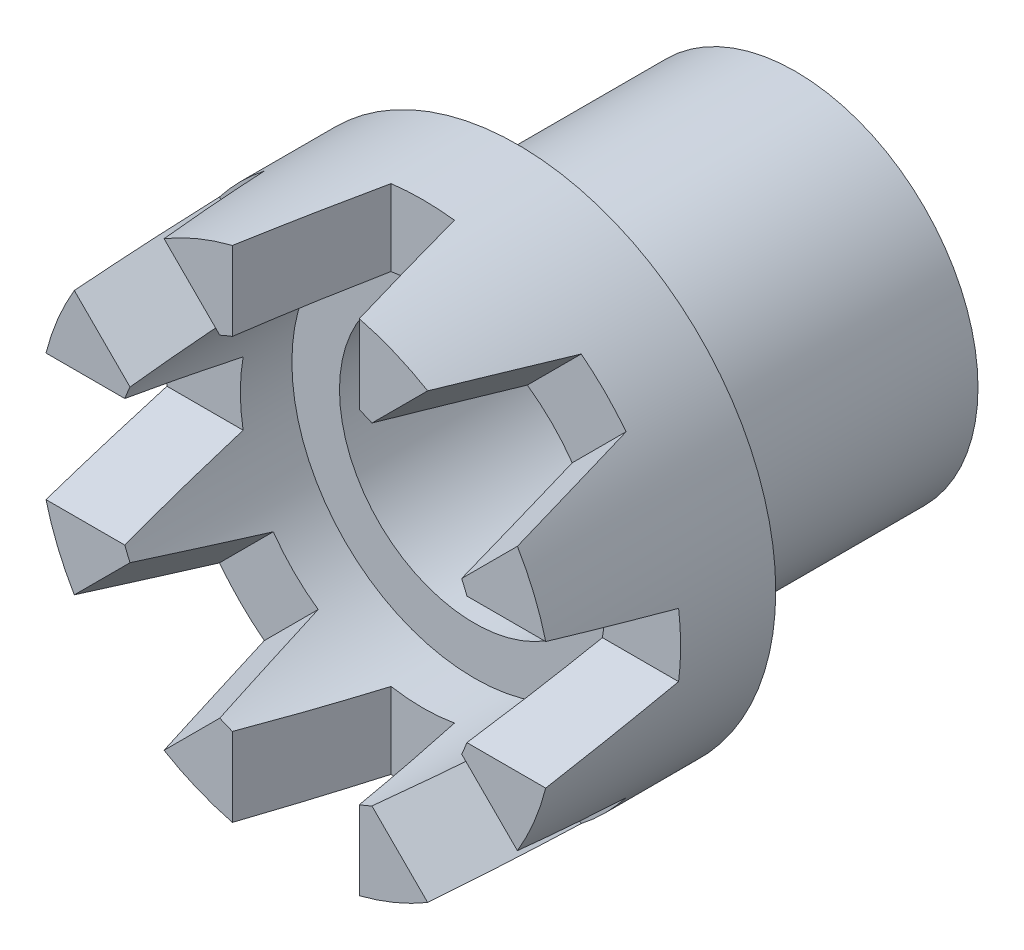
ISO-10303-21;
HEADER;
FILE_DESCRIPTION(('STEP AP214'),'2;1');
FILE_NAME('part.step','',(''),(''),'','','');
FILE_SCHEMA(('AUTOMOTIVE_DESIGN { 1 0 10303 214 1 1 1 1 }'));
ENDSEC;
DATA;
#1=APPLICATION_CONTEXT('core data for automotive mechanical design processes');
#2=APPLICATION_PROTOCOL_DEFINITION('international standard','automotive_design',2000,#1);
#3=PRODUCT_CONTEXT('',#1,'mechanical');
#4=PRODUCT('Part','Part','',(#3));
#5=PRODUCT_RELATED_PRODUCT_CATEGORY('part','',(#4));
#6=PRODUCT_DEFINITION_FORMATION('','',#4);
#7=PRODUCT_DEFINITION_CONTEXT('part definition',#1,'design');
#8=PRODUCT_DEFINITION('design','',#6,#7);
#9=PRODUCT_DEFINITION_SHAPE('','',#8);
#10=(LENGTH_UNIT() NAMED_UNIT(*) SI_UNIT(.MILLI.,.METRE.));
#11=(NAMED_UNIT(*) PLANE_ANGLE_UNIT() SI_UNIT($,.RADIAN.));
#12=(NAMED_UNIT(*) SI_UNIT($,.STERADIAN.) SOLID_ANGLE_UNIT());
#13=UNCERTAINTY_MEASURE_WITH_UNIT(LENGTH_MEASURE(1.E-05),#10,'distance_accuracy_value','');
#14=(GEOMETRIC_REPRESENTATION_CONTEXT(3) GLOBAL_UNCERTAINTY_ASSIGNED_CONTEXT((#13)) GLOBAL_UNIT_ASSIGNED_CONTEXT((#10,
#11,#12)) REPRESENTATION_CONTEXT('',''));
#15=CARTESIAN_POINT('',(0.,0.,0.));
#16=DIRECTION('',(0.,0.,1.));
#17=DIRECTION('',(1.,0.,0.));
#18=AXIS2_PLACEMENT_3D('',#15,#16,#17);
#19=CARTESIAN_POINT('',(0.,0.,0.));
#20=DIRECTION('',(0.,0.,1.));
#21=DIRECTION('',(1.,0.,0.));
#22=AXIS2_PLACEMENT_3D('',#19,#20,#21);
#23=CYLINDRICAL_SURFACE('',#22,46.);
#24=CARTESIAN_POINT('',(0.,0.,-45.));
#25=DIRECTION('',(0.,0.,1.));
#26=DIRECTION('',(1.,0.,0.));
#27=AXIS2_PLACEMENT_3D('',#24,#25,#26);
#28=CIRCLE('',#27,46.);
#29=CARTESIAN_POINT('',(46.,0.,-45.));
#30=VERTEX_POINT('',#29);
#31=EDGE_CURVE('E351',#30,#30,#28,.T.);
#32=ORIENTED_EDGE('',*,*,#31,.F.);
#33=EDGE_LOOP('',(#32));
#34=FACE_BOUND('',#33,.T.);
#35=CARTESIAN_POINT('',(0.,0.,-64.));
#36=DIRECTION('',(-0.685994340570035,0.685994340570035,0.242535625036333));
#37=DIRECTION('',(0.171498585142509,-0.171498585142509,0.970142500145332));
#38=AXIS2_PLACEMENT_3D('',#35,#36,#37);
#39=ELLIPSE('',#38,189.662858778412,46.);
#40=CARTESIAN_POINT('',(37.6880890055863,26.3743805066015,-32.));
#41=VERTEX_POINT('',#40);
#42=CARTESIAN_POINT('',(41.8096098629386,19.182192864969,0.));
#43=VERTEX_POINT('',#42);
#44=EDGE_CURVE('E267',#41,#43,#39,.F.);
#45=ORIENTED_EDGE('',*,*,#44,.F.);
#46=CARTESIAN_POINT('',(0.,0.,-32.));
#47=DIRECTION('',(0.,0.,1.));
#48=DIRECTION('',(1.,0.,0.));
#49=AXIS2_PLACEMENT_3D('',#46,#47,#48);
#50=CIRCLE('',#49,46.);
#51=CARTESIAN_POINT('',(26.3743805066015,37.6880890055863,-32.));
#52=VERTEX_POINT('',#51);
#53=EDGE_CURVE('E270',#52,#41,#50,.F.);
#54=ORIENTED_EDGE('',*,*,#53,.F.);
#55=CARTESIAN_POINT('',(0.,0.,-64.));
#56=DIRECTION('',(0.685994340570035,-0.685994340570035,0.242535625036333));
#57=DIRECTION('',(-0.171498585142509,0.171498585142509,0.970142500145332));
#58=AXIS2_PLACEMENT_3D('',#55,#56,#57);
#59=ELLIPSE('',#58,189.662858778412,46.);
#60=CARTESIAN_POINT('',(19.1821928649691,41.8096098629386,0.));
#61=VERTEX_POINT('',#60);
#62=EDGE_CURVE('E250',#61,#52,#59,.F.);
#63=ORIENTED_EDGE('',*,*,#62,.F.);
#64=CARTESIAN_POINT('',(0.,0.,0.));
#65=DIRECTION('',(0.,0.,1.));
#66=DIRECTION('',(1.,0.,0.));
#67=AXIS2_PLACEMENT_3D('',#64,#65,#66);
#68=CIRCLE('',#67,46.);
#69=CARTESIAN_POINT('',(16.,43.1277173056956,0.));
#70=VERTEX_POINT('',#69);
#71=EDGE_CURVE('E386',#61,#70,#68,.T.);
#72=ORIENTED_EDGE('',*,*,#71,.T.);
#73=CARTESIAN_POINT('',(0.,0.,-64.));
#74=DIRECTION('',(-0.970142500145332,0.,0.242535625036333));
#75=DIRECTION('',(0.242535625036333,0.,0.970142500145332));
#76=AXIS2_PLACEMENT_3D('',#73,#74,#75);
#77=ELLIPSE('',#76,189.662858778412,46.);
#78=CARTESIAN_POINT('',(8.,45.2990066116245,-32.));
#79=VERTEX_POINT('',#78);
#80=EDGE_CURVE('E320',#79,#70,#77,.F.);
#81=ORIENTED_EDGE('',*,*,#80,.F.);
#82=CARTESIAN_POINT('',(0.,0.,-32.));
#83=DIRECTION('',(0.,0.,1.));
#84=DIRECTION('',(1.,0.,0.));
#85=AXIS2_PLACEMENT_3D('',#82,#83,#84);
#86=CIRCLE('',#85,46.);
#87=CARTESIAN_POINT('',(-8.,45.2990066116245,-32.));
#88=VERTEX_POINT('',#87);
#89=EDGE_CURVE('E317',#88,#79,#86,.F.);
#90=ORIENTED_EDGE('',*,*,#89,.F.);
#91=CARTESIAN_POINT('',(0.,0.,-64.));
#92=DIRECTION('',(0.970142500145332,0.,0.242535625036333));
#93=DIRECTION('',(-0.242535625036333,0.,0.970142500145332));
#94=AXIS2_PLACEMENT_3D('',#91,#92,#93);
#95=ELLIPSE('',#94,189.662858778412,46.);
#96=CARTESIAN_POINT('',(-16.,43.1277173056956,0.));
#97=VERTEX_POINT('',#96);
#98=EDGE_CURVE('E316',#97,#88,#95,.F.);
#99=ORIENTED_EDGE('',*,*,#98,.F.);
#100=CARTESIAN_POINT('',(-19.182192864969,41.8096098629386,0.));
#101=VERTEX_POINT('',#100);
#102=EDGE_CURVE('E484',#97,#101,#68,.T.);
#103=ORIENTED_EDGE('',*,*,#102,.T.);
#104=CARTESIAN_POINT('',(0.,0.,-64.));
#105=DIRECTION('',(-0.685994340570035,-0.685994340570035,0.242535625036333));
#106=DIRECTION('',(0.171498585142509,0.171498585142509,0.970142500145332));
#107=AXIS2_PLACEMENT_3D('',#104,#105,#106);
#108=ELLIPSE('',#107,189.662858778412,46.);
#109=CARTESIAN_POINT('',(-26.3743805066015,37.6880890055863,-32.));
#110=VERTEX_POINT('',#109);
#111=EDGE_CURVE('E294',#110,#101,#108,.F.);
#112=ORIENTED_EDGE('',*,*,#111,.F.);
#113=CARTESIAN_POINT('',(0.,0.,-32.));
#114=DIRECTION('',(0.,0.,1.));
#115=DIRECTION('',(1.,0.,0.));
#116=AXIS2_PLACEMENT_3D('',#113,#114,#115);
#117=CIRCLE('',#116,46.);
#118=CARTESIAN_POINT('',(-37.6880890055863,26.3743805066016,-32.));
#119=VERTEX_POINT('',#118);
#120=EDGE_CURVE('E291',#119,#110,#117,.F.);
#121=ORIENTED_EDGE('',*,*,#120,.F.);
#122=CARTESIAN_POINT('',(0.,0.,-64.));
#123=DIRECTION('',(0.685994340570035,0.685994340570035,0.242535625036333));
#124=DIRECTION('',(-0.171498585142509,-0.171498585142509,0.970142500145332));
#125=AXIS2_PLACEMENT_3D('',#122,#123,#124);
#126=ELLIPSE('',#125,189.662858778412,46.);
#127=CARTESIAN_POINT('',(-41.8096098629386,19.182192864969,0.));
#128=VERTEX_POINT('',#127);
#129=EDGE_CURVE('E290',#128,#119,#126,.F.);
#130=ORIENTED_EDGE('',*,*,#129,.F.);
#131=CARTESIAN_POINT('',(-43.1277173056956,16.,0.));
#132=VERTEX_POINT('',#131);
#133=EDGE_CURVE('E482',#128,#132,#68,.T.);
#134=ORIENTED_EDGE('',*,*,#133,.T.);
#135=CARTESIAN_POINT('',(0.,0.,-64.));
#136=DIRECTION('',(0.,-0.970142500145332,0.242535625036333));
#137=DIRECTION('',(0.,0.242535625036333,0.970142500145332));
#138=AXIS2_PLACEMENT_3D('',#135,#136,#137);
#139=ELLIPSE('',#138,189.662858778412,46.);
#140=CARTESIAN_POINT('',(-45.2990066116245,8.,-32.));
#141=VERTEX_POINT('',#140);
#142=EDGE_CURVE('E340',#141,#132,#139,.F.);
#143=ORIENTED_EDGE('',*,*,#142,.F.);
#144=CARTESIAN_POINT('',(0.,0.,-32.));
#145=DIRECTION('',(0.,0.,1.));
#146=DIRECTION('',(1.,0.,0.));
#147=AXIS2_PLACEMENT_3D('',#144,#145,#146);
#148=CIRCLE('',#147,46.);
#149=CARTESIAN_POINT('',(-45.2990066116245,-8.,-32.));
#150=VERTEX_POINT('',#149);
#151=EDGE_CURVE('E346',#150,#141,#148,.F.);
#152=ORIENTED_EDGE('',*,*,#151,.F.);
#153=CARTESIAN_POINT('',(0.,0.,-64.));
#154=DIRECTION('',(0.,0.970142500145332,0.242535625036333));
#155=DIRECTION('',(0.,-0.242535625036333,0.970142500145332));
#156=AXIS2_PLACEMENT_3D('',#153,#154,#155);
#157=ELLIPSE('',#156,189.662858778412,46.);
#158=CARTESIAN_POINT('',(-43.1277173056956,-16.,0.));
#159=VERTEX_POINT('',#158);
#160=EDGE_CURVE('E350',#159,#150,#157,.F.);
#161=ORIENTED_EDGE('',*,*,#160,.F.);
#162=CARTESIAN_POINT('',(-41.8096098629386,-19.182192864969,0.));
#163=VERTEX_POINT('',#162);
#164=EDGE_CURVE('E388',#159,#163,#68,.T.);
#165=ORIENTED_EDGE('',*,*,#164,.T.);
#166=CARTESIAN_POINT('',(-37.6880890055863,-26.3743805066016,-32.));
#167=VERTEX_POINT('',#166);
#168=EDGE_CURVE('E45',#167,#163,#59,.F.);
#169=ORIENTED_EDGE('',*,*,#168,.F.);
#170=CARTESIAN_POINT('',(-26.3743805066016,-37.6880890055863,-32.));
#171=VERTEX_POINT('',#170);
#172=EDGE_CURVE('E272',#171,#167,#50,.F.);
#173=ORIENTED_EDGE('',*,*,#172,.F.);
#174=CARTESIAN_POINT('',(-19.1821928649691,-41.8096098629386,0.));
#175=VERTEX_POINT('',#174);
#176=EDGE_CURVE('E269',#175,#171,#39,.F.);
#177=ORIENTED_EDGE('',*,*,#176,.F.);
#178=CARTESIAN_POINT('',(-16.,-43.1277173056956,0.));
#179=VERTEX_POINT('',#178);
#180=EDGE_CURVE('E387',#175,#179,#68,.T.);
#181=ORIENTED_EDGE('',*,*,#180,.T.);
#182=CARTESIAN_POINT('',(-8.,-45.2990066116245,-32.));
#183=VERTEX_POINT('',#182);
#184=EDGE_CURVE('E313',#183,#179,#95,.F.);
#185=ORIENTED_EDGE('',*,*,#184,.F.);
#186=CARTESIAN_POINT('',(8.,-45.2990066116245,-32.));
#187=VERTEX_POINT('',#186);
#188=EDGE_CURVE('E319',#187,#183,#86,.F.);
#189=ORIENTED_EDGE('',*,*,#188,.F.);
#190=CARTESIAN_POINT('',(16.,-43.1277173056956,0.));
#191=VERTEX_POINT('',#190);
#192=EDGE_CURVE('E323',#191,#187,#77,.F.);
#193=ORIENTED_EDGE('',*,*,#192,.F.);
#194=CARTESIAN_POINT('',(19.182192864969,-41.8096098629386,0.));
#195=VERTEX_POINT('',#194);
#196=EDGE_CURVE('E481',#191,#195,#68,.T.);
#197=ORIENTED_EDGE('',*,*,#196,.T.);
#198=CARTESIAN_POINT('',(26.3743805066015,-37.6880890055863,-32.));
#199=VERTEX_POINT('',#198);
#200=EDGE_CURVE('E288',#199,#195,#126,.F.);
#201=ORIENTED_EDGE('',*,*,#200,.F.);
#202=CARTESIAN_POINT('',(37.6880890055863,-26.3743805066016,-32.));
#203=VERTEX_POINT('',#202);
#204=EDGE_CURVE('E293',#203,#199,#117,.F.);
#205=ORIENTED_EDGE('',*,*,#204,.F.);
#206=CARTESIAN_POINT('',(41.8096098629386,-19.1821928649691,0.));
#207=VERTEX_POINT('',#206);
#208=EDGE_CURVE('E296',#207,#203,#108,.F.);
#209=ORIENTED_EDGE('',*,*,#208,.F.);
#210=CARTESIAN_POINT('',(43.1277173056956,-16.,0.));
#211=VERTEX_POINT('',#210);
#212=EDGE_CURVE('E443',#207,#211,#68,.T.);
#213=ORIENTED_EDGE('',*,*,#212,.T.);
#214=CARTESIAN_POINT('',(45.2990066116245,-8.,-32.));
#215=VERTEX_POINT('',#214);
#216=EDGE_CURVE('E347',#215,#211,#157,.F.);
#217=ORIENTED_EDGE('',*,*,#216,.F.);
#218=CARTESIAN_POINT('',(45.2990066116245,8.,-32.));
#219=VERTEX_POINT('',#218);
#220=EDGE_CURVE('E344',#219,#215,#148,.F.);
#221=ORIENTED_EDGE('',*,*,#220,.F.);
#222=CARTESIAN_POINT('',(43.1277173056956,16.,0.));
#223=VERTEX_POINT('',#222);
#224=EDGE_CURVE('E343',#223,#219,#139,.F.);
#225=ORIENTED_EDGE('',*,*,#224,.F.);
#226=EDGE_CURVE('E382',#223,#43,#68,.T.);
#227=ORIENTED_EDGE('',*,*,#226,.T.);
#228=EDGE_LOOP('',(#45,#54,#63,#72,#81,#90,#99,#103,#112,#121,#130,#134,#143,#152,#161,#165,
#169,#173,#177,#181,#185,#189,#193,#197,#201,#205,#209,#213,#217,#221,#225,#227));
#229=FACE_BOUND('',#228,.T.);
#230=ADVANCED_FACE('F31',(#34,#229),#23,.F.);
#231=CARTESIAN_POINT('',(0.,0.,0.));
#232=DIRECTION('',(0.,0.,1.));
#233=DIRECTION('',(1.,0.,0.));
#234=AXIS2_PLACEMENT_3D('',#231,#232,#233);
#235=CYLINDRICAL_SURFACE('',#234,65.);
#236=CARTESIAN_POINT('',(0.,0.,-56.));
#237=DIRECTION('',(0.,0.,1.));
#238=DIRECTION('',(1.,0.,0.));
#239=AXIS2_PLACEMENT_3D('',#236,#237,#238);
#240=CIRCLE('',#239,65.);
#241=CARTESIAN_POINT('',(65.,0.,-56.));
#242=VERTEX_POINT('',#241);
#243=EDGE_CURVE('E372',#242,#242,#240,.T.);
#244=ORIENTED_EDGE('',*,*,#243,.T.);
#245=EDGE_LOOP('',(#244));
#246=FACE_BOUND('',#245,.T.);
#247=CARTESIAN_POINT('',(0.,0.,-64.));
#248=DIRECTION('',(-0.685994340570035,0.685994340570035,0.242535625036333));
#249=DIRECTION('',(0.171498585142509,-0.171498585142509,0.970142500145332));
#250=AXIS2_PLACEMENT_3D('',#247,#248,#249);
#251=ELLIPSE('',#250,268.001865665148,65.);
#252=CARTESIAN_POINT('',(55.8614357137373,33.2340187157677,0.));
#253=VERTEX_POINT('',#252);
#254=CARTESIAN_POINT('',(51.2693525366943,39.9556440377096,-32.));
#255=VERTEX_POINT('',#254);
#256=EDGE_CURVE('E266',#253,#255,#251,.T.);
#257=ORIENTED_EDGE('',*,*,#256,.F.);
#258=CARTESIAN_POINT('',(0.,0.,0.));
#259=DIRECTION('',(0.,0.,1.));
#260=DIRECTION('',(1.,0.,0.));
#261=AXIS2_PLACEMENT_3D('',#258,#259,#260);
#262=CIRCLE('',#261,65.);
#263=CARTESIAN_POINT('',(63.,16.,0.));
#264=VERTEX_POINT('',#263);
#265=EDGE_CURVE('E381',#264,#253,#262,.T.);
#266=ORIENTED_EDGE('',*,*,#265,.F.);
#267=CARTESIAN_POINT('',(0.,0.,-64.));
#268=DIRECTION('',(0.,-0.970142500145332,0.242535625036333));
#269=DIRECTION('',(0.,0.242535625036333,0.970142500145332));
#270=AXIS2_PLACEMENT_3D('',#267,#268,#269);
#271=ELLIPSE('',#270,268.001865665148,65.);
#272=CARTESIAN_POINT('',(64.5058136914806,8.,-32.));
#273=VERTEX_POINT('',#272);
#274=EDGE_CURVE('E394',#273,#264,#271,.T.);
#275=ORIENTED_EDGE('',*,*,#274,.F.);
#276=CARTESIAN_POINT('',(0.,0.,-32.));
#277=DIRECTION('',(0.,0.,1.));
#278=DIRECTION('',(1.,0.,0.));
#279=AXIS2_PLACEMENT_3D('',#276,#277,#278);
#280=CIRCLE('',#279,65.);
#281=CARTESIAN_POINT('',(64.5058136914806,-8.,-32.));
#282=VERTEX_POINT('',#281);
#283=EDGE_CURVE('E391',#282,#273,#280,.T.);
#284=ORIENTED_EDGE('',*,*,#283,.F.);
#285=CARTESIAN_POINT('',(0.,0.,-64.));
#286=DIRECTION('',(0.,0.970142500145332,0.242535625036333));
#287=DIRECTION('',(0.,-0.242535625036333,0.970142500145332));
#288=AXIS2_PLACEMENT_3D('',#285,#286,#287);
#289=ELLIPSE('',#288,268.001865665148,65.);
#290=CARTESIAN_POINT('',(63.,-16.,0.));
#291=VERTEX_POINT('',#290);
#292=EDGE_CURVE('E393',#291,#282,#289,.T.);
#293=ORIENTED_EDGE('',*,*,#292,.F.);
#294=CARTESIAN_POINT('',(55.8614357137373,-33.2340187157677,0.));
#295=VERTEX_POINT('',#294);
#296=EDGE_CURVE('E375',#295,#291,#262,.T.);
#297=ORIENTED_EDGE('',*,*,#296,.F.);
#298=CARTESIAN_POINT('',(0.,0.,-64.));
#299=DIRECTION('',(-0.685994340570035,-0.685994340570035,0.242535625036333));
#300=DIRECTION('',(0.171498585142509,0.171498585142509,0.970142500145332));
#301=AXIS2_PLACEMENT_3D('',#298,#299,#300);
#302=ELLIPSE('',#301,268.001865665148,65.);
#303=CARTESIAN_POINT('',(51.2693525366943,-39.9556440377096,-32.));
#304=VERTEX_POINT('',#303);
#305=EDGE_CURVE('E408',#304,#295,#302,.T.);
#306=ORIENTED_EDGE('',*,*,#305,.F.);
#307=CARTESIAN_POINT('',(0.,0.,-32.));
#308=DIRECTION('',(0.,0.,1.));
#309=DIRECTION('',(1.,0.,0.));
#310=AXIS2_PLACEMENT_3D('',#307,#308,#309);
#311=CIRCLE('',#310,65.);
#312=CARTESIAN_POINT('',(39.9556440377096,-51.2693525366943,-32.));
#313=VERTEX_POINT('',#312);
#314=EDGE_CURVE('E406',#313,#304,#311,.T.);
#315=ORIENTED_EDGE('',*,*,#314,.F.);
#316=CARTESIAN_POINT('',(0.,0.,-64.));
#317=DIRECTION('',(0.685994340570035,0.685994340570035,0.242535625036333));
#318=DIRECTION('',(-0.171498585142509,-0.171498585142509,0.970142500145332));
#319=AXIS2_PLACEMENT_3D('',#316,#317,#318);
#320=ELLIPSE('',#319,268.001865665148,65.);
#321=CARTESIAN_POINT('',(33.2340187157677,-55.8614357137373,0.));
#322=VERTEX_POINT('',#321);
#323=EDGE_CURVE('E414',#322,#313,#320,.T.);
#324=ORIENTED_EDGE('',*,*,#323,.F.);
#325=CARTESIAN_POINT('',(16.,-63.,0.));
#326=VERTEX_POINT('',#325);
#327=EDGE_CURVE('E436',#326,#322,#262,.T.);
#328=ORIENTED_EDGE('',*,*,#327,.F.);
#329=CARTESIAN_POINT('',(0.,0.,-64.));
#330=DIRECTION('',(-0.970142500145332,0.,0.242535625036333));
#331=DIRECTION('',(0.242535625036333,0.,0.970142500145332));
#332=AXIS2_PLACEMENT_3D('',#329,#330,#331);
#333=ELLIPSE('',#332,268.001865665148,65.);
#334=CARTESIAN_POINT('',(8.,-64.5058136914806,-32.));
#335=VERTEX_POINT('',#334);
#336=EDGE_CURVE('E399',#335,#326,#333,.T.);
#337=ORIENTED_EDGE('',*,*,#336,.F.);
#338=CARTESIAN_POINT('',(0.,0.,-32.));
#339=DIRECTION('',(0.,0.,1.));
#340=DIRECTION('',(1.,0.,0.));
#341=AXIS2_PLACEMENT_3D('',#338,#339,#340);
#342=CIRCLE('',#341,65.);
#343=CARTESIAN_POINT('',(-8.,-64.5058136914806,-32.));
#344=VERTEX_POINT('',#343);
#345=EDGE_CURVE('E397',#344,#335,#342,.T.);
#346=ORIENTED_EDGE('',*,*,#345,.F.);
#347=CARTESIAN_POINT('',(0.,0.,-64.));
#348=DIRECTION('',(0.970142500145332,0.,0.242535625036333));
#349=DIRECTION('',(-0.242535625036333,0.,0.970142500145332));
#350=AXIS2_PLACEMENT_3D('',#347,#348,#349);
#351=ELLIPSE('',#350,268.001865665148,65.);
#352=CARTESIAN_POINT('',(-16.,-63.,0.));
#353=VERTEX_POINT('',#352);
#354=EDGE_CURVE('E405',#353,#344,#351,.T.);
#355=ORIENTED_EDGE('',*,*,#354,.F.);
#356=CARTESIAN_POINT('',(-33.2340187157677,-55.8614357137373,0.));
#357=VERTEX_POINT('',#356);
#358=EDGE_CURVE('E380',#357,#353,#262,.T.);
#359=ORIENTED_EDGE('',*,*,#358,.F.);
#360=CARTESIAN_POINT('',(-39.9556440377096,-51.2693525366943,-32.));
#361=VERTEX_POINT('',#360);
#362=EDGE_CURVE('E264',#361,#357,#251,.T.);
#363=ORIENTED_EDGE('',*,*,#362,.F.);
#364=CARTESIAN_POINT('',(0.,0.,-32.));
#365=DIRECTION('',(0.,0.,1.));
#366=DIRECTION('',(1.,0.,0.));
#367=AXIS2_PLACEMENT_3D('',#364,#365,#366);
#368=CIRCLE('',#367,65.);
#369=CARTESIAN_POINT('',(-51.2693525366943,-39.9556440377096,-32.));
#370=VERTEX_POINT('',#369);
#371=EDGE_CURVE('E34',#370,#361,#368,.T.);
#372=ORIENTED_EDGE('',*,*,#371,.F.);
#373=CARTESIAN_POINT('',(0.,0.,-64.));
#374=DIRECTION('',(0.685994340570035,-0.685994340570035,0.242535625036333));
#375=DIRECTION('',(-0.171498585142509,0.171498585142509,0.970142500145332));
#376=AXIS2_PLACEMENT_3D('',#373,#374,#375);
#377=ELLIPSE('',#376,268.001865665148,65.);
#378=CARTESIAN_POINT('',(-55.8614357137373,-33.2340187157677,0.));
#379=VERTEX_POINT('',#378);
#380=EDGE_CURVE('E258',#379,#370,#377,.T.);
#381=ORIENTED_EDGE('',*,*,#380,.F.);
#382=CARTESIAN_POINT('',(-63.,-16.,0.));
#383=VERTEX_POINT('',#382);
#384=EDGE_CURVE('E376',#383,#379,#262,.T.);
#385=ORIENTED_EDGE('',*,*,#384,.F.);
#386=CARTESIAN_POINT('',(-64.5058136914806,-8.,-32.));
#387=VERTEX_POINT('',#386);
#388=EDGE_CURVE('E390',#387,#383,#289,.T.);
#389=ORIENTED_EDGE('',*,*,#388,.F.);
#390=CARTESIAN_POINT('',(-64.5058136914806,8.,-32.));
#391=VERTEX_POINT('',#390);
#392=EDGE_CURVE('E385',#391,#387,#280,.T.);
#393=ORIENTED_EDGE('',*,*,#392,.F.);
#394=CARTESIAN_POINT('',(-63.,16.,0.));
#395=VERTEX_POINT('',#394);
#396=EDGE_CURVE('E396',#395,#391,#271,.T.);
#397=ORIENTED_EDGE('',*,*,#396,.F.);
#398=CARTESIAN_POINT('',(-55.8614357137373,33.2340187157677,0.));
#399=VERTEX_POINT('',#398);
#400=EDGE_CURVE('E379',#399,#395,#262,.T.);
#401=ORIENTED_EDGE('',*,*,#400,.F.);
#402=CARTESIAN_POINT('',(-51.2693525366943,39.9556440377096,-32.));
#403=VERTEX_POINT('',#402);
#404=EDGE_CURVE('E412',#403,#399,#320,.T.);
#405=ORIENTED_EDGE('',*,*,#404,.F.);
#406=CARTESIAN_POINT('',(-39.9556440377096,51.2693525366943,-32.));
#407=VERTEX_POINT('',#406);
#408=EDGE_CURVE('E409',#407,#403,#311,.T.);
#409=ORIENTED_EDGE('',*,*,#408,.F.);
#410=CARTESIAN_POINT('',(-33.2340187157677,55.8614357137373,0.));
#411=VERTEX_POINT('',#410);
#412=EDGE_CURVE('E411',#411,#407,#302,.T.);
#413=ORIENTED_EDGE('',*,*,#412,.F.);
#414=CARTESIAN_POINT('',(-16.,63.,0.));
#415=VERTEX_POINT('',#414);
#416=EDGE_CURVE('E438',#415,#411,#262,.T.);
#417=ORIENTED_EDGE('',*,*,#416,.F.);
#418=CARTESIAN_POINT('',(-8.,64.5058136914806,-32.));
#419=VERTEX_POINT('',#418);
#420=EDGE_CURVE('E403',#419,#415,#351,.T.);
#421=ORIENTED_EDGE('',*,*,#420,.F.);
#422=CARTESIAN_POINT('',(8.,64.5058136914806,-32.));
#423=VERTEX_POINT('',#422);
#424=EDGE_CURVE('E400',#423,#419,#342,.T.);
#425=ORIENTED_EDGE('',*,*,#424,.F.);
#426=CARTESIAN_POINT('',(16.,63.,0.));
#427=VERTEX_POINT('',#426);
#428=EDGE_CURVE('E402',#427,#423,#333,.T.);
#429=ORIENTED_EDGE('',*,*,#428,.F.);
#430=CARTESIAN_POINT('',(33.2340187157677,55.8614357137373,0.));
#431=VERTEX_POINT('',#430);
#432=EDGE_CURVE('E257',#431,#427,#262,.T.);
#433=ORIENTED_EDGE('',*,*,#432,.F.);
#434=CARTESIAN_POINT('',(39.9556440377095,51.2693525366943,-32.));
#435=VERTEX_POINT('',#434);
#436=EDGE_CURVE('E53',#435,#431,#377,.T.);
#437=ORIENTED_EDGE('',*,*,#436,.F.);
#438=EDGE_CURVE('E11',#255,#435,#368,.T.);
#439=ORIENTED_EDGE('',*,*,#438,.F.);
#440=EDGE_LOOP('',(#257,#266,#275,#284,#293,#297,#306,#315,#324,#328,#337,#346,#355,#359,#363,
#372,#381,#385,#389,#393,#397,#401,#405,#409,#413,#417,#421,#425,#429,#433,#437,#439));
#441=FACE_BOUND('',#440,.T.);
#442=ADVANCED_FACE('F255',(#246,#441),#235,.T.);
#443=CARTESIAN_POINT('',(0.,46.,0.));
#444=DIRECTION('',(0.,0.,-1.));
#445=DIRECTION('',(-1.,0.,0.));
#446=AXIS2_PLACEMENT_3D('',#443,#444,#445);
#447=PLANE('',#446);
#448=DIRECTION('',(-0.707106781186548,-0.707106781186547,0.));
#449=VECTOR('',#448,1.);
#450=CARTESIAN_POINT('',(57.2756492761104,34.6482322781408,0.));
#451=LINE('',#450,#449);
#452=EDGE_CURVE('E498',#175,#357,#451,.T.);
#453=ORIENTED_EDGE('',*,*,#452,.T.);
#454=ORIENTED_EDGE('',*,*,#358,.T.);
#455=DIRECTION('',(0.,-1.,0.));
#456=VECTOR('',#455,1.);
#457=CARTESIAN_POINT('',(-16.,65.,0.));
#458=LINE('',#457,#456);
#459=EDGE_CURVE('E301',#179,#353,#458,.T.);
#460=ORIENTED_EDGE('',*,*,#459,.F.);
#461=ORIENTED_EDGE('',*,*,#180,.F.);
#462=EDGE_LOOP('',(#453,#454,#460,#461));
#463=FACE_BOUND('',#462,.T.);
#464=ADVANCED_FACE('F501',(#463),#447,.F.);
#465=DIRECTION('',(-0.707106781186548,-0.707106781186547,0.));
#466=VECTOR('',#465,1.);
#467=CARTESIAN_POINT('',(34.6482322781408,57.2756492761104,0.));
#468=LINE('',#467,#466);
#469=EDGE_CURVE('E497',#163,#379,#468,.T.);
#470=ORIENTED_EDGE('',*,*,#469,.F.);
#471=ORIENTED_EDGE('',*,*,#164,.F.);
#472=DIRECTION('',(-1.,0.,0.));
#473=VECTOR('',#472,1.);
#474=CARTESIAN_POINT('',(65.,-16.,0.));
#475=LINE('',#474,#473);
#476=EDGE_CURVE('E324',#159,#383,#475,.T.);
#477=ORIENTED_EDGE('',*,*,#476,.T.);
#478=ORIENTED_EDGE('',*,*,#384,.T.);
#479=EDGE_LOOP('',(#470,#471,#477,#478));
#480=FACE_BOUND('',#479,.T.);
#481=ADVANCED_FACE('F495',(#480),#447,.F.);
#482=DIRECTION('',(0.707106781186548,0.707106781186547,0.));
#483=VECTOR('',#482,1.);
#484=CARTESIAN_POINT('',(34.3137084989848,11.6862915010152,0.));
#485=LINE('',#484,#483);
#486=EDGE_CURVE('E416',#43,#253,#485,.T.);
#487=ORIENTED_EDGE('',*,*,#486,.F.);
#488=ORIENTED_EDGE('',*,*,#226,.F.);
#489=DIRECTION('',(-1.,0.,0.));
#490=VECTOR('',#489,1.);
#491=CARTESIAN_POINT('',(65.,16.,0.));
#492=LINE('',#491,#490);
#493=EDGE_CURVE('E331',#264,#223,#492,.T.);
#494=ORIENTED_EDGE('',*,*,#493,.F.);
#495=ORIENTED_EDGE('',*,*,#265,.T.);
#496=EDGE_LOOP('',(#487,#488,#494,#495));
#497=FACE_BOUND('',#496,.T.);
#498=ADVANCED_FACE('F475',(#497),#447,.F.);
#499=DIRECTION('',(-0.707106781186548,-0.707106781186547,0.));
#500=VECTOR('',#499,1.);
#501=CARTESIAN_POINT('',(11.6862915010152,34.3137084989848,0.));
#502=LINE('',#501,#500);
#503=EDGE_CURVE('E415',#431,#61,#502,.T.);
#504=ORIENTED_EDGE('',*,*,#503,.F.);
#505=ORIENTED_EDGE('',*,*,#432,.T.);
#506=DIRECTION('',(0.,-1.,0.));
#507=VECTOR('',#506,1.);
#508=CARTESIAN_POINT('',(16.,65.,0.));
#509=LINE('',#508,#507);
#510=EDGE_CURVE('E300',#427,#70,#509,.T.);
#511=ORIENTED_EDGE('',*,*,#510,.T.);
#512=ORIENTED_EDGE('',*,*,#71,.F.);
#513=EDGE_LOOP('',(#504,#505,#511,#512));
#514=FACE_BOUND('',#513,.T.);
#515=ADVANCED_FACE('F576',(#514),#447,.F.);
#516=DIRECTION('',(0.707106781186547,-0.707106781186548,0.));
#517=VECTOR('',#516,1.);
#518=CARTESIAN_POINT('',(-34.6482322781408,57.2756492761104,0.));
#519=LINE('',#518,#517);
#520=EDGE_CURVE('E273',#207,#295,#519,.T.);
#521=ORIENTED_EDGE('',*,*,#520,.T.);
#522=ORIENTED_EDGE('',*,*,#296,.T.);
#523=EDGE_CURVE('E327',#291,#211,#475,.T.);
#524=ORIENTED_EDGE('',*,*,#523,.T.);
#525=ORIENTED_EDGE('',*,*,#212,.F.);
#526=EDGE_LOOP('',(#521,#522,#524,#525));
#527=FACE_BOUND('',#526,.T.);
#528=ADVANCED_FACE('F453',(#527),#447,.F.);
#529=DIRECTION('',(0.707106781186547,-0.707106781186548,0.));
#530=VECTOR('',#529,1.);
#531=CARTESIAN_POINT('',(-57.2756492761104,34.6482322781408,0.));
#532=LINE('',#531,#530);
#533=EDGE_CURVE('E277',#195,#322,#532,.T.);
#534=ORIENTED_EDGE('',*,*,#533,.F.);
#535=ORIENTED_EDGE('',*,*,#196,.F.);
#536=EDGE_CURVE('E297',#191,#326,#509,.T.);
#537=ORIENTED_EDGE('',*,*,#536,.T.);
#538=ORIENTED_EDGE('',*,*,#327,.T.);
#539=EDGE_LOOP('',(#534,#535,#537,#538));
#540=FACE_BOUND('',#539,.T.);
#541=ADVANCED_FACE('F556',(#540),#447,.F.);
#542=EDGE_CURVE('E276',#411,#101,#519,.T.);
#543=ORIENTED_EDGE('',*,*,#542,.T.);
#544=ORIENTED_EDGE('',*,*,#102,.F.);
#545=EDGE_CURVE('E304',#415,#97,#458,.T.);
#546=ORIENTED_EDGE('',*,*,#545,.F.);
#547=ORIENTED_EDGE('',*,*,#416,.T.);
#548=EDGE_LOOP('',(#543,#544,#546,#547));
#549=FACE_BOUND('',#548,.T.);
#550=ADVANCED_FACE('F539',(#549),#447,.F.);
#551=EDGE_CURVE('E279',#399,#128,#532,.T.);
#552=ORIENTED_EDGE('',*,*,#551,.F.);
#553=ORIENTED_EDGE('',*,*,#400,.T.);
#554=EDGE_CURVE('E328',#132,#395,#492,.T.);
#555=ORIENTED_EDGE('',*,*,#554,.F.);
#556=ORIENTED_EDGE('',*,*,#133,.F.);
#557=EDGE_LOOP('',(#552,#553,#555,#556));
#558=FACE_BOUND('',#557,.T.);
#559=ADVANCED_FACE('F517',(#558),#447,.F.);
#560=CARTESIAN_POINT('',(0.,65.,-56.));
#561=DIRECTION('',(0.,0.,1.));
#562=DIRECTION('',(1.,0.,0.));
#563=AXIS2_PLACEMENT_3D('',#560,#561,#562);
#564=PLANE('',#563);
#565=ORIENTED_EDGE('',*,*,#243,.F.);
#566=EDGE_LOOP('',(#565));
#567=FACE_BOUND('',#566,.T.);
#568=CARTESIAN_POINT('',(0.,0.,-56.));
#569=DIRECTION('',(0.,0.,1.));
#570=DIRECTION('',(1.,0.,0.));
#571=AXIS2_PLACEMENT_3D('',#568,#569,#570);
#572=CIRCLE('',#571,46.);
#573=CARTESIAN_POINT('',(46.,0.,-56.));
#574=VERTEX_POINT('',#573);
#575=EDGE_CURVE('E369',#574,#574,#572,.T.);
#576=ORIENTED_EDGE('',*,*,#575,.T.);
#577=EDGE_LOOP('',(#576));
#578=FACE_BOUND('',#577,.T.);
#579=ADVANCED_FACE('F628',(#567,#578),#564,.F.);
#580=CARTESIAN_POINT('',(0.,0.,0.));
#581=DIRECTION('',(0.,0.,1.));
#582=DIRECTION('',(1.,0.,0.));
#583=AXIS2_PLACEMENT_3D('',#580,#581,#582);
#584=CYLINDRICAL_SURFACE('',#583,46.);
#585=ORIENTED_EDGE('',*,*,#575,.F.);
#586=EDGE_LOOP('',(#585));
#587=FACE_BOUND('',#586,.T.);
#588=CARTESIAN_POINT('',(0.,0.,-126.));
#589=DIRECTION('',(0.,0.,1.));
#590=DIRECTION('',(1.,0.,0.));
#591=AXIS2_PLACEMENT_3D('',#588,#589,#590);
#592=CIRCLE('',#591,46.);
#593=CARTESIAN_POINT('',(46.,0.,-126.));
#594=VERTEX_POINT('',#593);
#595=EDGE_CURVE('E366',#594,#594,#592,.T.);
#596=ORIENTED_EDGE('',*,*,#595,.T.);
#597=EDGE_LOOP('',(#596));
#598=FACE_BOUND('',#597,.T.);
#599=ADVANCED_FACE('F624',(#587,#598),#584,.T.);
#600=CARTESIAN_POINT('',(0.,46.,-126.));
#601=DIRECTION('',(0.,0.,1.));
#602=DIRECTION('',(1.,0.,0.));
#603=AXIS2_PLACEMENT_3D('',#600,#601,#602);
#604=PLANE('',#603);
#605=ORIENTED_EDGE('',*,*,#595,.F.);
#606=EDGE_LOOP('',(#605));
#607=FACE_BOUND('',#606,.T.);
#608=CARTESIAN_POINT('',(0.,0.,-126.));
#609=DIRECTION('',(0.,0.,1.));
#610=DIRECTION('',(1.,0.,0.));
#611=AXIS2_PLACEMENT_3D('',#608,#609,#610);
#612=CIRCLE('',#611,32.);
#613=CARTESIAN_POINT('',(32.,0.,-126.));
#614=VERTEX_POINT('',#613);
#615=EDGE_CURVE('E363',#614,#614,#612,.T.);
#616=ORIENTED_EDGE('',*,*,#615,.T.);
#617=EDGE_LOOP('',(#616));
#618=FACE_BOUND('',#617,.T.);
#619=ADVANCED_FACE('F620',(#607,#618),#604,.F.);
#620=CARTESIAN_POINT('',(0.,0.,0.));
#621=DIRECTION('',(0.,0.,1.));
#622=DIRECTION('',(1.,0.,0.));
#623=AXIS2_PLACEMENT_3D('',#620,#621,#622);
#624=CYLINDRICAL_SURFACE('',#623,32.);
#625=ORIENTED_EDGE('',*,*,#615,.F.);
#626=EDGE_LOOP('',(#625));
#627=FACE_BOUND('',#626,.T.);
#628=CARTESIAN_POINT('',(0.,0.,-123.));
#629=DIRECTION('',(0.,0.,1.));
#630=DIRECTION('',(1.,0.,0.));
#631=AXIS2_PLACEMENT_3D('',#628,#629,#630);
#632=CIRCLE('',#631,32.);
#633=CARTESIAN_POINT('',(32.,0.,-123.));
#634=VERTEX_POINT('',#633);
#635=EDGE_CURVE('E360',#634,#634,#632,.T.);
#636=ORIENTED_EDGE('',*,*,#635,.T.);
#637=EDGE_LOOP('',(#636));
#638=FACE_BOUND('',#637,.T.);
#639=ADVANCED_FACE('F616',(#627,#638),#624,.F.);
#640=CARTESIAN_POINT('',(0.,32.,-123.));
#641=DIRECTION('',(0.,0.,-1.));
#642=DIRECTION('',(-1.,0.,0.));
#643=AXIS2_PLACEMENT_3D('',#640,#641,#642);
#644=PLANE('',#643);
#645=ORIENTED_EDGE('',*,*,#635,.F.);
#646=EDGE_LOOP('',(#645));
#647=FACE_BOUND('',#646,.T.);
#648=CARTESIAN_POINT('',(0.,0.,-123.));
#649=DIRECTION('',(0.,0.,1.));
#650=DIRECTION('',(1.,0.,0.));
#651=AXIS2_PLACEMENT_3D('',#648,#649,#650);
#652=CIRCLE('',#651,34.);
#653=CARTESIAN_POINT('',(34.,0.,-123.));
#654=VERTEX_POINT('',#653);
#655=EDGE_CURVE('E357',#654,#654,#652,.T.);
#656=ORIENTED_EDGE('',*,*,#655,.T.);
#657=EDGE_LOOP('',(#656));
#658=FACE_BOUND('',#657,.T.);
#659=ADVANCED_FACE('F607',(#647,#658),#644,.F.);
#660=CARTESIAN_POINT('',(0.,0.,0.));
#661=DIRECTION('',(0.,0.,1.));
#662=DIRECTION('',(1.,0.,0.));
#663=AXIS2_PLACEMENT_3D('',#660,#661,#662);
#664=CYLINDRICAL_SURFACE('',#663,34.);
#665=ORIENTED_EDGE('',*,*,#655,.F.);
#666=EDGE_LOOP('',(#665));
#667=FACE_BOUND('',#666,.T.);
#668=CARTESIAN_POINT('',(0.,0.,-45.));
#669=DIRECTION('',(0.,0.,1.));
#670=DIRECTION('',(1.,0.,0.));
#671=AXIS2_PLACEMENT_3D('',#668,#669,#670);
#672=CIRCLE('',#671,34.);
#673=CARTESIAN_POINT('',(34.,0.,-45.));
#674=VERTEX_POINT('',#673);
#675=EDGE_CURVE('E354',#674,#674,#672,.T.);
#676=ORIENTED_EDGE('',*,*,#675,.T.);
#677=EDGE_LOOP('',(#676));
#678=FACE_BOUND('',#677,.T.);
#679=ADVANCED_FACE('F599',(#667,#678),#664,.F.);
#680=CARTESIAN_POINT('',(0.,34.,-45.));
#681=DIRECTION('',(0.,0.,-1.));
#682=DIRECTION('',(-1.,0.,0.));
#683=AXIS2_PLACEMENT_3D('',#680,#681,#682);
#684=PLANE('',#683);
#685=ORIENTED_EDGE('',*,*,#675,.F.);
#686=EDGE_LOOP('',(#685));
#687=FACE_BOUND('',#686,.T.);
#688=ORIENTED_EDGE('',*,*,#31,.T.);
#689=EDGE_LOOP('',(#688));
#690=FACE_BOUND('',#689,.T.);
#691=ADVANCED_FACE('F597',(#687,#690),#684,.F.);
#692=CARTESIAN_POINT('',(65.,16.,0.));
#693=DIRECTION('',(0.,-0.970142500145332,0.242535625036333));
#694=DIRECTION('',(0.,-0.242535625036333,-0.970142500145332));
#695=AXIS2_PLACEMENT_3D('',#692,#693,#694);
#696=PLANE('',#695);
#697=ORIENTED_EDGE('',*,*,#224,.T.);
#698=DIRECTION('',(-1.,0.,0.));
#699=VECTOR('',#698,1.);
#700=CARTESIAN_POINT('',(65.,8.,-32.));
#701=LINE('',#700,#699);
#702=EDGE_CURVE('E335',#273,#219,#701,.T.);
#703=ORIENTED_EDGE('',*,*,#702,.F.);
#704=ORIENTED_EDGE('',*,*,#274,.T.);
#705=ORIENTED_EDGE('',*,*,#493,.T.);
#706=EDGE_LOOP('',(#697,#703,#704,#705));
#707=FACE_BOUND('',#706,.T.);
#708=ADVANCED_FACE('F470',(#707),#696,.T.);
#709=CARTESIAN_POINT('',(65.,-8.,-32.));
#710=DIRECTION('',(0.,0.,1.));
#711=DIRECTION('',(1.,0.,0.));
#712=AXIS2_PLACEMENT_3D('',#709,#710,#711);
#713=PLANE('',#712);
#714=ORIENTED_EDGE('',*,*,#220,.T.);
#715=DIRECTION('',(-1.,0.,0.));
#716=VECTOR('',#715,1.);
#717=CARTESIAN_POINT('',(65.,-8.,-32.));
#718=LINE('',#717,#716);
#719=EDGE_CURVE('E339',#282,#215,#718,.T.);
#720=ORIENTED_EDGE('',*,*,#719,.F.);
#721=ORIENTED_EDGE('',*,*,#283,.T.);
#722=ORIENTED_EDGE('',*,*,#702,.T.);
#723=EDGE_LOOP('',(#714,#720,#721,#722));
#724=FACE_BOUND('',#723,.T.);
#725=ADVANCED_FACE('F467',(#724),#713,.T.);
#726=CARTESIAN_POINT('',(65.,-16.,0.));
#727=DIRECTION('',(0.,0.970142500145332,0.242535625036333));
#728=DIRECTION('',(0.,-0.242535625036333,0.970142500145332));
#729=AXIS2_PLACEMENT_3D('',#726,#727,#728);
#730=PLANE('',#729);
#731=ORIENTED_EDGE('',*,*,#216,.T.);
#732=ORIENTED_EDGE('',*,*,#523,.F.);
#733=ORIENTED_EDGE('',*,*,#292,.T.);
#734=ORIENTED_EDGE('',*,*,#719,.T.);
#735=EDGE_LOOP('',(#731,#732,#733,#734));
#736=FACE_BOUND('',#735,.T.);
#737=ADVANCED_FACE('F458',(#736),#730,.T.);
#738=ORIENTED_EDGE('',*,*,#160,.T.);
#739=EDGE_CURVE('E336',#150,#387,#718,.T.);
#740=ORIENTED_EDGE('',*,*,#739,.T.);
#741=ORIENTED_EDGE('',*,*,#388,.T.);
#742=ORIENTED_EDGE('',*,*,#476,.F.);
#743=EDGE_LOOP('',(#738,#740,#741,#742));
#744=FACE_BOUND('',#743,.T.);
#745=ADVANCED_FACE('F507',(#744),#730,.T.);
#746=ORIENTED_EDGE('',*,*,#151,.T.);
#747=EDGE_CURVE('E332',#141,#391,#701,.T.);
#748=ORIENTED_EDGE('',*,*,#747,.T.);
#749=ORIENTED_EDGE('',*,*,#392,.T.);
#750=ORIENTED_EDGE('',*,*,#739,.F.);
#751=EDGE_LOOP('',(#746,#748,#749,#750));
#752=FACE_BOUND('',#751,.T.);
#753=ADVANCED_FACE('F510',(#752),#713,.T.);
#754=ORIENTED_EDGE('',*,*,#142,.T.);
#755=ORIENTED_EDGE('',*,*,#554,.T.);
#756=ORIENTED_EDGE('',*,*,#396,.T.);
#757=ORIENTED_EDGE('',*,*,#747,.F.);
#758=EDGE_LOOP('',(#754,#755,#756,#757));
#759=FACE_BOUND('',#758,.T.);
#760=ADVANCED_FACE('F516',(#759),#696,.T.);
#761=CARTESIAN_POINT('',(-16.,65.,0.));
#762=DIRECTION('',(0.970142500145332,0.,0.242535625036333));
#763=DIRECTION('',(0.242535625036333,0.,-0.970142500145332));
#764=AXIS2_PLACEMENT_3D('',#761,#762,#763);
#765=PLANE('',#764);
#766=ORIENTED_EDGE('',*,*,#98,.T.);
#767=DIRECTION('',(0.,-1.,0.));
#768=VECTOR('',#767,1.);
#769=CARTESIAN_POINT('',(-8.,65.,-32.));
#770=LINE('',#769,#768);
#771=EDGE_CURVE('E308',#419,#88,#770,.T.);
#772=ORIENTED_EDGE('',*,*,#771,.F.);
#773=ORIENTED_EDGE('',*,*,#420,.T.);
#774=ORIENTED_EDGE('',*,*,#545,.T.);
#775=EDGE_LOOP('',(#766,#772,#773,#774));
#776=FACE_BOUND('',#775,.T.);
#777=ADVANCED_FACE('F663',(#776),#765,.T.);
#778=CARTESIAN_POINT('',(8.,65.,-32.));
#779=DIRECTION('',(0.,0.,1.));
#780=DIRECTION('',(1.,0.,0.));
#781=AXIS2_PLACEMENT_3D('',#778,#779,#780);
#782=PLANE('',#781);
#783=ORIENTED_EDGE('',*,*,#89,.T.);
#784=DIRECTION('',(0.,-1.,0.));
#785=VECTOR('',#784,1.);
#786=CARTESIAN_POINT('',(8.,65.,-32.));
#787=LINE('',#786,#785);
#788=EDGE_CURVE('E312',#423,#79,#787,.T.);
#789=ORIENTED_EDGE('',*,*,#788,.F.);
#790=ORIENTED_EDGE('',*,*,#424,.T.);
#791=ORIENTED_EDGE('',*,*,#771,.T.);
#792=EDGE_LOOP('',(#783,#789,#790,#791));
#793=FACE_BOUND('',#792,.T.);
#794=ADVANCED_FACE('F574',(#793),#782,.T.);
#795=CARTESIAN_POINT('',(16.,65.,0.));
#796=DIRECTION('',(-0.970142500145332,0.,0.242535625036333));
#797=DIRECTION('',(0.242535625036333,0.,0.970142500145332));
#798=AXIS2_PLACEMENT_3D('',#795,#796,#797);
#799=PLANE('',#798);
#800=ORIENTED_EDGE('',*,*,#80,.T.);
#801=ORIENTED_EDGE('',*,*,#510,.F.);
#802=ORIENTED_EDGE('',*,*,#428,.T.);
#803=ORIENTED_EDGE('',*,*,#788,.T.);
#804=EDGE_LOOP('',(#800,#801,#802,#803));
#805=FACE_BOUND('',#804,.T.);
#806=ADVANCED_FACE('F571',(#805),#799,.T.);
#807=ORIENTED_EDGE('',*,*,#192,.T.);
#808=EDGE_CURVE('E309',#187,#335,#787,.T.);
#809=ORIENTED_EDGE('',*,*,#808,.T.);
#810=ORIENTED_EDGE('',*,*,#336,.T.);
#811=ORIENTED_EDGE('',*,*,#536,.F.);
#812=EDGE_LOOP('',(#807,#809,#810,#811));
#813=FACE_BOUND('',#812,.T.);
#814=ADVANCED_FACE('F559',(#813),#799,.T.);
#815=ORIENTED_EDGE('',*,*,#188,.T.);
#816=EDGE_CURVE('E305',#183,#344,#770,.T.);
#817=ORIENTED_EDGE('',*,*,#816,.T.);
#818=ORIENTED_EDGE('',*,*,#345,.T.);
#819=ORIENTED_EDGE('',*,*,#808,.F.);
#820=EDGE_LOOP('',(#815,#817,#818,#819));
#821=FACE_BOUND('',#820,.T.);
#822=ADVANCED_FACE('F563',(#821),#782,.T.);
#823=ORIENTED_EDGE('',*,*,#184,.T.);
#824=ORIENTED_EDGE('',*,*,#459,.T.);
#825=ORIENTED_EDGE('',*,*,#354,.T.);
#826=ORIENTED_EDGE('',*,*,#816,.F.);
#827=EDGE_LOOP('',(#823,#824,#825,#826));
#828=FACE_BOUND('',#827,.T.);
#829=ADVANCED_FACE('F566',(#828),#765,.T.);
#830=CARTESIAN_POINT('',(-57.2756492761104,34.6482322781408,0.));
#831=DIRECTION('',(0.685994340570035,0.685994340570035,0.242535625036333));
#832=DIRECTION('',(-0.707106781186547,0.707106781186548,0.));
#833=AXIS2_PLACEMENT_3D('',#830,#831,#832);
#834=PLANE('',#833);
#835=ORIENTED_EDGE('',*,*,#129,.T.);
#836=DIRECTION('',(0.707106781186547,-0.707106781186548,0.));
#837=VECTOR('',#836,1.);
#838=CARTESIAN_POINT('',(-51.618795026618,40.3050865276332,-32.));
#839=LINE('',#838,#837);
#840=EDGE_CURVE('E283',#403,#119,#839,.T.);
#841=ORIENTED_EDGE('',*,*,#840,.F.);
#842=ORIENTED_EDGE('',*,*,#404,.T.);
#843=ORIENTED_EDGE('',*,*,#551,.T.);
#844=EDGE_LOOP('',(#835,#841,#842,#843));
#845=FACE_BOUND('',#844,.T.);
#846=ADVANCED_FACE('F523',(#845),#834,.T.);
#847=CARTESIAN_POINT('',(-40.3050865276332,51.618795026618,-32.));
#848=DIRECTION('',(0.,0.,1.));
#849=DIRECTION('',(1.,0.,0.));
#850=AXIS2_PLACEMENT_3D('',#847,#848,#849);
#851=PLANE('',#850);
#852=ORIENTED_EDGE('',*,*,#120,.T.);
#853=DIRECTION('',(0.707106781186547,-0.707106781186548,0.));
#854=VECTOR('',#853,1.);
#855=CARTESIAN_POINT('',(-40.3050865276332,51.618795026618,-32.));
#856=LINE('',#855,#854);
#857=EDGE_CURVE('E287',#407,#110,#856,.T.);
#858=ORIENTED_EDGE('',*,*,#857,.F.);
#859=ORIENTED_EDGE('',*,*,#408,.T.);
#860=ORIENTED_EDGE('',*,*,#840,.T.);
#861=EDGE_LOOP('',(#852,#858,#859,#860));
#862=FACE_BOUND('',#861,.T.);
#863=ADVANCED_FACE('F528',(#862),#851,.T.);
#864=CARTESIAN_POINT('',(-34.6482322781408,57.2756492761104,0.));
#865=DIRECTION('',(-0.685994340570035,-0.685994340570035,0.242535625036333));
#866=DIRECTION('',(0.707106781186547,-0.707106781186548,0.));
#867=AXIS2_PLACEMENT_3D('',#864,#865,#866);
#868=PLANE('',#867);
#869=ORIENTED_EDGE('',*,*,#111,.T.);
#870=ORIENTED_EDGE('',*,*,#542,.F.);
#871=ORIENTED_EDGE('',*,*,#412,.T.);
#872=ORIENTED_EDGE('',*,*,#857,.T.);
#873=EDGE_LOOP('',(#869,#870,#871,#872));
#874=FACE_BOUND('',#873,.T.);
#875=ADVANCED_FACE('F532',(#874),#868,.T.);
#876=ORIENTED_EDGE('',*,*,#208,.T.);
#877=EDGE_CURVE('E284',#203,#304,#856,.T.);
#878=ORIENTED_EDGE('',*,*,#877,.T.);
#879=ORIENTED_EDGE('',*,*,#305,.T.);
#880=ORIENTED_EDGE('',*,*,#520,.F.);
#881=EDGE_LOOP('',(#876,#878,#879,#880));
#882=FACE_BOUND('',#881,.T.);
#883=ADVANCED_FACE('F788',(#882),#868,.T.);
#884=ORIENTED_EDGE('',*,*,#204,.T.);
#885=EDGE_CURVE('E280',#199,#313,#839,.T.);
#886=ORIENTED_EDGE('',*,*,#885,.T.);
#887=ORIENTED_EDGE('',*,*,#314,.T.);
#888=ORIENTED_EDGE('',*,*,#877,.F.);
#889=EDGE_LOOP('',(#884,#886,#887,#888));
#890=FACE_BOUND('',#889,.T.);
#891=ADVANCED_FACE('F551',(#890),#851,.T.);
#892=ORIENTED_EDGE('',*,*,#200,.T.);
#893=ORIENTED_EDGE('',*,*,#533,.T.);
#894=ORIENTED_EDGE('',*,*,#323,.T.);
#895=ORIENTED_EDGE('',*,*,#885,.F.);
#896=EDGE_LOOP('',(#892,#893,#894,#895));
#897=FACE_BOUND('',#896,.T.);
#898=ADVANCED_FACE('F546',(#897),#834,.T.);
#899=CARTESIAN_POINT('',(57.2756492761104,34.6482322781408,0.));
#900=DIRECTION('',(-0.685994340570035,0.685994340570035,0.242535625036333));
#901=DIRECTION('',(-0.707106781186548,-0.707106781186547,0.));
#902=AXIS2_PLACEMENT_3D('',#899,#900,#901);
#903=PLANE('',#902);
#904=ORIENTED_EDGE('',*,*,#44,.T.);
#905=ORIENTED_EDGE('',*,*,#486,.T.);
#906=ORIENTED_EDGE('',*,*,#256,.T.);
#907=DIRECTION('',(-0.707106781186548,-0.707106781186547,0.));
#908=VECTOR('',#907,1.);
#909=CARTESIAN_POINT('',(51.618795026618,40.3050865276332,-32.));
#910=LINE('',#909,#908);
#911=EDGE_CURVE('E244',#255,#41,#910,.T.);
#912=ORIENTED_EDGE('',*,*,#911,.T.);
#913=EDGE_LOOP('',(#904,#905,#906,#912));
#914=FACE_BOUND('',#913,.T.);
#915=ADVANCED_FACE('F577',(#914),#903,.T.);
#916=CARTESIAN_POINT('',(34.6482322781408,57.2756492761104,0.));
#917=DIRECTION('',(0.685994340570035,-0.685994340570035,0.242535625036333));
#918=DIRECTION('',(0.707106781186548,0.707106781186547,0.));
#919=AXIS2_PLACEMENT_3D('',#916,#917,#918);
#920=PLANE('',#919);
#921=ORIENTED_EDGE('',*,*,#62,.T.);
#922=DIRECTION('',(-0.707106781186548,-0.707106781186547,0.));
#923=VECTOR('',#922,1.);
#924=CARTESIAN_POINT('',(40.3050865276332,51.618795026618,-32.));
#925=LINE('',#924,#923);
#926=EDGE_CURVE('E241',#435,#52,#925,.T.);
#927=ORIENTED_EDGE('',*,*,#926,.F.);
#928=ORIENTED_EDGE('',*,*,#436,.T.);
#929=ORIENTED_EDGE('',*,*,#503,.T.);
#930=EDGE_LOOP('',(#921,#927,#928,#929));
#931=FACE_BOUND('',#930,.T.);
#932=ADVANCED_FACE('F248',(#931),#920,.T.);
#933=CARTESIAN_POINT('',(51.618795026618,40.3050865276332,-32.));
#934=DIRECTION('',(0.,0.,1.));
#935=DIRECTION('',(1.,0.,0.));
#936=AXIS2_PLACEMENT_3D('',#933,#934,#935);
#937=PLANE('',#936);
#938=ORIENTED_EDGE('',*,*,#53,.T.);
#939=ORIENTED_EDGE('',*,*,#911,.F.);
#940=ORIENTED_EDGE('',*,*,#438,.T.);
#941=ORIENTED_EDGE('',*,*,#926,.T.);
#942=EDGE_LOOP('',(#938,#939,#940,#941));
#943=FACE_BOUND('',#942,.T.);
#944=ADVANCED_FACE('F240',(#943),#937,.T.);
#945=ORIENTED_EDGE('',*,*,#172,.T.);
#946=EDGE_CURVE('E252',#167,#370,#925,.T.);
#947=ORIENTED_EDGE('',*,*,#946,.T.);
#948=ORIENTED_EDGE('',*,*,#371,.T.);
#949=EDGE_CURVE('E251',#171,#361,#910,.T.);
#950=ORIENTED_EDGE('',*,*,#949,.F.);
#951=EDGE_LOOP('',(#945,#947,#948,#950));
#952=FACE_BOUND('',#951,.T.);
#953=ADVANCED_FACE('F423',(#952),#937,.T.);
#954=ORIENTED_EDGE('',*,*,#176,.T.);
#955=ORIENTED_EDGE('',*,*,#949,.T.);
#956=ORIENTED_EDGE('',*,*,#362,.T.);
#957=ORIENTED_EDGE('',*,*,#452,.F.);
#958=EDGE_LOOP('',(#954,#955,#956,#957));
#959=FACE_BOUND('',#958,.T.);
#960=ADVANCED_FACE('F428',(#959),#903,.T.);
#961=ORIENTED_EDGE('',*,*,#168,.T.);
#962=ORIENTED_EDGE('',*,*,#469,.T.);
#963=ORIENTED_EDGE('',*,*,#380,.T.);
#964=ORIENTED_EDGE('',*,*,#946,.F.);
#965=EDGE_LOOP('',(#961,#962,#963,#964));
#966=FACE_BOUND('',#965,.T.);
#967=ADVANCED_FACE('F502',(#966),#920,.T.);
#968=CLOSED_SHELL('',(#230,#442,#464,#481,#498,#515,#528,#541,#550,#559,#579,#599,#619,#639,
#659,#679,#691,#708,#725,#737,#745,#753,#760,#777,#794,#806,#814,#822,#829,#846,#863,#875,#883,
#891,#898,#915,#932,#944,#953,#960,#967));
#969=MANIFOLD_SOLID_BREP('B2',#968);
#970=ADVANCED_BREP_SHAPE_REPRESENTATION('',(#18,#969),#14);
#971=SHAPE_DEFINITION_REPRESENTATION(#9,#970);
ENDSEC;
END-ISO-10303-21;
